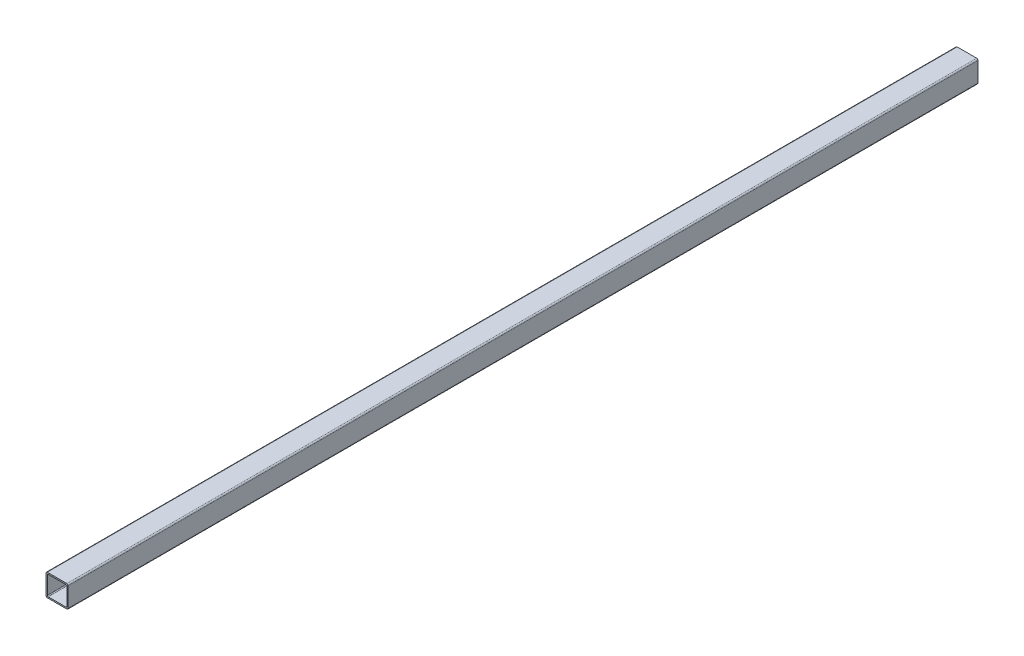
ISO-10303-21;
HEADER;
FILE_DESCRIPTION(('STEP AP214'),'2;1');
FILE_NAME('part.step','',(''),(''),'','','');
FILE_SCHEMA(('AUTOMOTIVE_DESIGN { 1 0 10303 214 1 1 1 1 }'));
ENDSEC;
DATA;
#1=APPLICATION_CONTEXT('core data for automotive mechanical design processes');
#2=APPLICATION_PROTOCOL_DEFINITION('international standard','automotive_design',2000,#1);
#3=PRODUCT_CONTEXT('',#1,'mechanical');
#4=PRODUCT('Part','Part','',(#3));
#5=PRODUCT_RELATED_PRODUCT_CATEGORY('part','',(#4));
#6=PRODUCT_DEFINITION_FORMATION('','',#4);
#7=PRODUCT_DEFINITION_CONTEXT('part definition',#1,'design');
#8=PRODUCT_DEFINITION('design','',#6,#7);
#9=PRODUCT_DEFINITION_SHAPE('','',#8);
#10=(LENGTH_UNIT() NAMED_UNIT(*) SI_UNIT(.MILLI.,.METRE.));
#11=(NAMED_UNIT(*) PLANE_ANGLE_UNIT() SI_UNIT($,.RADIAN.));
#12=(NAMED_UNIT(*) SI_UNIT($,.STERADIAN.) SOLID_ANGLE_UNIT());
#13=UNCERTAINTY_MEASURE_WITH_UNIT(LENGTH_MEASURE(1.E-05),#10,'distance_accuracy_value','');
#14=(GEOMETRIC_REPRESENTATION_CONTEXT(3) GLOBAL_UNCERTAINTY_ASSIGNED_CONTEXT((#13)) GLOBAL_UNIT_ASSIGNED_CONTEXT((#10,
#11,#12)) REPRESENTATION_CONTEXT('',''));
#15=CARTESIAN_POINT('',(0.,0.,0.));
#16=DIRECTION('',(0.,0.,1.));
#17=DIRECTION('',(1.,0.,0.));
#18=AXIS2_PLACEMENT_3D('',#15,#16,#17);
#19=CARTESIAN_POINT('',(-22.,-22.,-2054.3306612069));
#20=DIRECTION('',(0.,0.,1.));
#21=DIRECTION('',(1.,0.,0.));
#22=AXIS2_PLACEMENT_3D('',#19,#20,#21);
#23=CYLINDRICAL_SURFACE('',#22,3.);
#24=CARTESIAN_POINT('',(-22.,-22.,0.));
#25=DIRECTION('',(0.,0.,1.));
#26=DIRECTION('',(1.,0.,0.));
#27=AXIS2_PLACEMENT_3D('',#24,#25,#26);
#28=CIRCLE('',#27,3.);
#29=CARTESIAN_POINT('',(-25.,-22.,0.));
#30=VERTEX_POINT('',#29);
#31=CARTESIAN_POINT('',(-22.,-25.,0.));
#32=VERTEX_POINT('',#31);
#33=EDGE_CURVE('E204',#30,#32,#28,.T.);
#34=ORIENTED_EDGE('',*,*,#33,.F.);
#35=DIRECTION('',(0.,0.,1.));
#36=VECTOR('',#35,1.);
#37=CARTESIAN_POINT('',(-25.,-22.,-2054.3306612069));
#38=LINE('',#37,#36);
#39=CARTESIAN_POINT('',(-25.,-22.,-2054.3306612069));
#40=VERTEX_POINT('',#39);
#41=EDGE_CURVE('E11',#40,#30,#38,.T.);
#42=ORIENTED_EDGE('',*,*,#41,.F.);
#43=CARTESIAN_POINT('',(-22.,-22.,-2054.3306612069));
#44=DIRECTION('',(0.,0.,1.));
#45=DIRECTION('',(1.,0.,0.));
#46=AXIS2_PLACEMENT_3D('',#43,#44,#45);
#47=CIRCLE('',#46,3.);
#48=CARTESIAN_POINT('',(-22.,-25.,-2054.3306612069));
#49=VERTEX_POINT('',#48);
#50=EDGE_CURVE('E216',#40,#49,#47,.T.);
#51=ORIENTED_EDGE('',*,*,#50,.T.);
#52=DIRECTION('',(0.,0.,1.));
#53=VECTOR('',#52,1.);
#54=CARTESIAN_POINT('',(-22.,-25.,-2054.3306612069));
#55=LINE('',#54,#53);
#56=EDGE_CURVE('E37',#49,#32,#55,.T.);
#57=ORIENTED_EDGE('',*,*,#56,.T.);
#58=EDGE_LOOP('',(#34,#42,#51,#57));
#59=FACE_BOUND('',#58,.T.);
#60=ADVANCED_FACE('F34',(#59),#23,.T.);
#61=CARTESIAN_POINT('',(-25.,22.,-2054.3306612069));
#62=DIRECTION('',(-1.,0.,0.));
#63=DIRECTION('',(0.,0.,1.));
#64=AXIS2_PLACEMENT_3D('',#61,#62,#63);
#65=PLANE('',#64);
#66=DIRECTION('',(0.,-1.,0.));
#67=VECTOR('',#66,1.);
#68=CARTESIAN_POINT('',(-25.,22.,0.));
#69=LINE('',#68,#67);
#70=CARTESIAN_POINT('',(-25.,22.,0.));
#71=VERTEX_POINT('',#70);
#72=EDGE_CURVE('E220',#71,#30,#69,.T.);
#73=ORIENTED_EDGE('',*,*,#72,.F.);
#74=DIRECTION('',(0.,0.,1.));
#75=VECTOR('',#74,1.);
#76=CARTESIAN_POINT('',(-25.,22.,-2054.3306612069));
#77=LINE('',#76,#75);
#78=CARTESIAN_POINT('',(-25.,22.,-2054.3306612069));
#79=VERTEX_POINT('',#78);
#80=EDGE_CURVE('E42',#79,#71,#77,.T.);
#81=ORIENTED_EDGE('',*,*,#80,.F.);
#82=DIRECTION('',(0.,-1.,0.));
#83=VECTOR('',#82,1.);
#84=CARTESIAN_POINT('',(-25.,22.,-2054.3306612069));
#85=LINE('',#84,#83);
#86=EDGE_CURVE('E238',#79,#40,#85,.T.);
#87=ORIENTED_EDGE('',*,*,#86,.T.);
#88=ORIENTED_EDGE('',*,*,#41,.T.);
#89=EDGE_LOOP('',(#73,#81,#87,#88));
#90=FACE_BOUND('',#89,.T.);
#91=ADVANCED_FACE('F285',(#90),#65,.T.);
#92=CARTESIAN_POINT('',(-22.,22.,-2054.3306612069));
#93=DIRECTION('',(0.,0.,1.));
#94=DIRECTION('',(1.,0.,0.));
#95=AXIS2_PLACEMENT_3D('',#92,#93,#94);
#96=CYLINDRICAL_SURFACE('',#95,3.);
#97=CARTESIAN_POINT('',(-22.,22.,0.));
#98=DIRECTION('',(0.,0.,1.));
#99=DIRECTION('',(1.,0.,0.));
#100=AXIS2_PLACEMENT_3D('',#97,#98,#99);
#101=CIRCLE('',#100,3.);
#102=CARTESIAN_POINT('',(-22.,25.,0.));
#103=VERTEX_POINT('',#102);
#104=EDGE_CURVE('E258',#103,#71,#101,.T.);
#105=ORIENTED_EDGE('',*,*,#104,.F.);
#106=DIRECTION('',(0.,0.,1.));
#107=VECTOR('',#106,1.);
#108=CARTESIAN_POINT('',(-22.,25.,-2054.3306612069));
#109=LINE('',#108,#107);
#110=CARTESIAN_POINT('',(-22.,25.,-2054.3306612069));
#111=VERTEX_POINT('',#110);
#112=EDGE_CURVE('E264',#111,#103,#109,.T.);
#113=ORIENTED_EDGE('',*,*,#112,.F.);
#114=CARTESIAN_POINT('',(-22.,22.,-2054.3306612069));
#115=DIRECTION('',(0.,0.,1.));
#116=DIRECTION('',(1.,0.,0.));
#117=AXIS2_PLACEMENT_3D('',#114,#115,#116);
#118=CIRCLE('',#117,3.);
#119=EDGE_CURVE('E235',#111,#79,#118,.T.);
#120=ORIENTED_EDGE('',*,*,#119,.T.);
#121=ORIENTED_EDGE('',*,*,#80,.T.);
#122=EDGE_LOOP('',(#105,#113,#120,#121));
#123=FACE_BOUND('',#122,.T.);
#124=ADVANCED_FACE('F304',(#123),#96,.T.);
#125=CARTESIAN_POINT('',(-22.,25.,-2054.3306612069));
#126=DIRECTION('',(0.,1.,0.));
#127=DIRECTION('',(-1.,0.,0.));
#128=AXIS2_PLACEMENT_3D('',#125,#126,#127);
#129=PLANE('',#128);
#130=DIRECTION('',(-1.,0.,0.));
#131=VECTOR('',#130,1.);
#132=CARTESIAN_POINT('',(-22.,25.,0.));
#133=LINE('',#132,#131);
#134=CARTESIAN_POINT('',(22.,25.,0.));
#135=VERTEX_POINT('',#134);
#136=EDGE_CURVE('E255',#135,#103,#133,.T.);
#137=ORIENTED_EDGE('',*,*,#136,.F.);
#138=DIRECTION('',(0.,0.,1.));
#139=VECTOR('',#138,1.);
#140=CARTESIAN_POINT('',(22.,25.,-2054.3306612069));
#141=LINE('',#140,#139);
#142=CARTESIAN_POINT('',(22.,25.,-2054.3306612069));
#143=VERTEX_POINT('',#142);
#144=EDGE_CURVE('E266',#143,#135,#141,.T.);
#145=ORIENTED_EDGE('',*,*,#144,.F.);
#146=DIRECTION('',(-1.,0.,0.));
#147=VECTOR('',#146,1.);
#148=CARTESIAN_POINT('',(-22.,25.,-2054.3306612069));
#149=LINE('',#148,#147);
#150=EDGE_CURVE('E232',#143,#111,#149,.T.);
#151=ORIENTED_EDGE('',*,*,#150,.T.);
#152=ORIENTED_EDGE('',*,*,#112,.T.);
#153=EDGE_LOOP('',(#137,#145,#151,#152));
#154=FACE_BOUND('',#153,.T.);
#155=ADVANCED_FACE('F302',(#154),#129,.T.);
#156=CARTESIAN_POINT('',(22.,22.,-2054.3306612069));
#157=DIRECTION('',(0.,0.,1.));
#158=DIRECTION('',(1.,0.,0.));
#159=AXIS2_PLACEMENT_3D('',#156,#157,#158);
#160=CYLINDRICAL_SURFACE('',#159,3.00000000000001);
#161=CARTESIAN_POINT('',(22.,22.,0.));
#162=DIRECTION('',(0.,0.,1.));
#163=DIRECTION('',(-1.,0.,0.));
#164=AXIS2_PLACEMENT_3D('',#161,#162,#163);
#165=CIRCLE('',#164,3.00000000000001);
#166=CARTESIAN_POINT('',(25.,22.,0.));
#167=VERTEX_POINT('',#166);
#168=EDGE_CURVE('E252',#167,#135,#165,.T.);
#169=ORIENTED_EDGE('',*,*,#168,.F.);
#170=DIRECTION('',(0.,0.,1.));
#171=VECTOR('',#170,1.);
#172=CARTESIAN_POINT('',(25.,22.,-2054.3306612069));
#173=LINE('',#172,#171);
#174=CARTESIAN_POINT('',(25.,22.,-2054.3306612069));
#175=VERTEX_POINT('',#174);
#176=EDGE_CURVE('E268',#175,#167,#173,.T.);
#177=ORIENTED_EDGE('',*,*,#176,.F.);
#178=CARTESIAN_POINT('',(22.,22.,-2054.3306612069));
#179=DIRECTION('',(0.,0.,1.));
#180=DIRECTION('',(-1.,0.,0.));
#181=AXIS2_PLACEMENT_3D('',#178,#179,#180);
#182=CIRCLE('',#181,3.00000000000001);
#183=EDGE_CURVE('E229',#175,#143,#182,.T.);
#184=ORIENTED_EDGE('',*,*,#183,.T.);
#185=ORIENTED_EDGE('',*,*,#144,.T.);
#186=EDGE_LOOP('',(#169,#177,#184,#185));
#187=FACE_BOUND('',#186,.T.);
#188=ADVANCED_FACE('F298',(#187),#160,.T.);
#189=CARTESIAN_POINT('',(25.,22.,-2054.3306612069));
#190=DIRECTION('',(1.,0.,0.));
#191=DIRECTION('',(0.,0.,-1.));
#192=AXIS2_PLACEMENT_3D('',#189,#190,#191);
#193=PLANE('',#192);
#194=DIRECTION('',(0.,1.,0.));
#195=VECTOR('',#194,1.);
#196=CARTESIAN_POINT('',(25.,22.,0.));
#197=LINE('',#196,#195);
#198=CARTESIAN_POINT('',(25.,-22.,0.));
#199=VERTEX_POINT('',#198);
#200=EDGE_CURVE('E249',#199,#167,#197,.T.);
#201=ORIENTED_EDGE('',*,*,#200,.F.);
#202=DIRECTION('',(0.,0.,1.));
#203=VECTOR('',#202,1.);
#204=CARTESIAN_POINT('',(25.,-22.,-2054.3306612069));
#205=LINE('',#204,#203);
#206=CARTESIAN_POINT('',(25.,-22.,-2054.3306612069));
#207=VERTEX_POINT('',#206);
#208=EDGE_CURVE('E270',#207,#199,#205,.T.);
#209=ORIENTED_EDGE('',*,*,#208,.F.);
#210=DIRECTION('',(0.,1.,0.));
#211=VECTOR('',#210,1.);
#212=CARTESIAN_POINT('',(25.,22.,-2054.3306612069));
#213=LINE('',#212,#211);
#214=EDGE_CURVE('E226',#207,#175,#213,.T.);
#215=ORIENTED_EDGE('',*,*,#214,.T.);
#216=ORIENTED_EDGE('',*,*,#176,.T.);
#217=EDGE_LOOP('',(#201,#209,#215,#216));
#218=FACE_BOUND('',#217,.T.);
#219=ADVANCED_FACE('F296',(#218),#193,.T.);
#220=CARTESIAN_POINT('',(22.,-22.,-2054.3306612069));
#221=DIRECTION('',(0.,0.,1.));
#222=DIRECTION('',(1.,0.,0.));
#223=AXIS2_PLACEMENT_3D('',#220,#221,#222);
#224=CYLINDRICAL_SURFACE('',#223,3.);
#225=CARTESIAN_POINT('',(22.,-22.,0.));
#226=DIRECTION('',(0.,0.,1.));
#227=DIRECTION('',(1.,0.,0.));
#228=AXIS2_PLACEMENT_3D('',#225,#226,#227);
#229=CIRCLE('',#228,3.);
#230=CARTESIAN_POINT('',(22.,-25.,0.));
#231=VERTEX_POINT('',#230);
#232=EDGE_CURVE('E246',#231,#199,#229,.T.);
#233=ORIENTED_EDGE('',*,*,#232,.F.);
#234=DIRECTION('',(0.,0.,1.));
#235=VECTOR('',#234,1.);
#236=CARTESIAN_POINT('',(22.,-25.,-2054.3306612069));
#237=LINE('',#236,#235);
#238=CARTESIAN_POINT('',(22.,-25.,-2054.3306612069));
#239=VERTEX_POINT('',#238);
#240=EDGE_CURVE('E271',#239,#231,#237,.T.);
#241=ORIENTED_EDGE('',*,*,#240,.F.);
#242=CARTESIAN_POINT('',(22.,-22.,-2054.3306612069));
#243=DIRECTION('',(0.,0.,1.));
#244=DIRECTION('',(1.,0.,0.));
#245=AXIS2_PLACEMENT_3D('',#242,#243,#244);
#246=CIRCLE('',#245,3.);
#247=EDGE_CURVE('E223',#239,#207,#246,.T.);
#248=ORIENTED_EDGE('',*,*,#247,.T.);
#249=ORIENTED_EDGE('',*,*,#208,.T.);
#250=EDGE_LOOP('',(#233,#241,#248,#249));
#251=FACE_BOUND('',#250,.T.);
#252=ADVANCED_FACE('F292',(#251),#224,.T.);
#253=CARTESIAN_POINT('',(-22.,-25.,-2054.3306612069));
#254=DIRECTION('',(0.,-1.,0.));
#255=DIRECTION('',(0.,0.,-1.));
#256=AXIS2_PLACEMENT_3D('',#253,#254,#255);
#257=PLANE('',#256);
#258=DIRECTION('',(1.,0.,0.));
#259=VECTOR('',#258,1.);
#260=CARTESIAN_POINT('',(-22.,-25.,0.));
#261=LINE('',#260,#259);
#262=EDGE_CURVE('E243',#32,#231,#261,.T.);
#263=ORIENTED_EDGE('',*,*,#262,.F.);
#264=ORIENTED_EDGE('',*,*,#56,.F.);
#265=DIRECTION('',(1.,0.,0.));
#266=VECTOR('',#265,1.);
#267=CARTESIAN_POINT('',(-22.,-25.,-2054.3306612069));
#268=LINE('',#267,#266);
#269=EDGE_CURVE('E219',#49,#239,#268,.T.);
#270=ORIENTED_EDGE('',*,*,#269,.T.);
#271=ORIENTED_EDGE('',*,*,#240,.T.);
#272=EDGE_LOOP('',(#263,#264,#270,#271));
#273=FACE_BOUND('',#272,.T.);
#274=ADVANCED_FACE('F279',(#273),#257,.T.);
#275=CARTESIAN_POINT('',(-22.,-22.,-2054.3306612069));
#276=DIRECTION('',(0.,0.,1.));
#277=DIRECTION('',(1.,0.,0.));
#278=AXIS2_PLACEMENT_3D('',#275,#276,#277);
#279=PLANE('',#278);
#280=DIRECTION('',(0.,-1.,0.));
#281=VECTOR('',#280,1.);
#282=CARTESIAN_POINT('',(-22.,20.,-2054.3306612069));
#283=LINE('',#282,#281);
#284=CARTESIAN_POINT('',(-22.,20.,-2054.3306612069));
#285=VERTEX_POINT('',#284);
#286=CARTESIAN_POINT('',(-22.,-20.,-2054.3306612069));
#287=VERTEX_POINT('',#286);
#288=EDGE_CURVE('E155',#285,#287,#283,.T.);
#289=ORIENTED_EDGE('',*,*,#288,.T.);
#290=CARTESIAN_POINT('',(-20.,-20.,-2054.3306612069));
#291=DIRECTION('',(0.,0.,1.));
#292=DIRECTION('',(1.,0.,0.));
#293=AXIS2_PLACEMENT_3D('',#290,#291,#292);
#294=CIRCLE('',#293,2.);
#295=CARTESIAN_POINT('',(-20.,-22.,-2054.3306612069));
#296=VERTEX_POINT('',#295);
#297=EDGE_CURVE('E149',#287,#296,#294,.T.);
#298=ORIENTED_EDGE('',*,*,#297,.T.);
#299=DIRECTION('',(1.,0.,0.));
#300=VECTOR('',#299,1.);
#301=CARTESIAN_POINT('',(-20.,-22.,-2054.3306612069));
#302=LINE('',#301,#300);
#303=CARTESIAN_POINT('',(20.,-22.,-2054.3306612069));
#304=VERTEX_POINT('',#303);
#305=EDGE_CURVE('E158',#296,#304,#302,.T.);
#306=ORIENTED_EDGE('',*,*,#305,.T.);
#307=CARTESIAN_POINT('',(20.,-20.,-2054.3306612069));
#308=DIRECTION('',(0.,0.,1.));
#309=DIRECTION('',(1.,0.,0.));
#310=AXIS2_PLACEMENT_3D('',#307,#308,#309);
#311=CIRCLE('',#310,2.);
#312=CARTESIAN_POINT('',(22.,-20.,-2054.3306612069));
#313=VERTEX_POINT('',#312);
#314=EDGE_CURVE('E50',#304,#313,#311,.T.);
#315=ORIENTED_EDGE('',*,*,#314,.T.);
#316=DIRECTION('',(0.,1.,0.));
#317=VECTOR('',#316,1.);
#318=CARTESIAN_POINT('',(22.,20.,-2054.3306612069));
#319=LINE('',#318,#317);
#320=CARTESIAN_POINT('',(22.,20.,-2054.3306612069));
#321=VERTEX_POINT('',#320);
#322=EDGE_CURVE('E173',#313,#321,#319,.T.);
#323=ORIENTED_EDGE('',*,*,#322,.T.);
#324=CARTESIAN_POINT('',(20.,20.,-2054.3306612069));
#325=DIRECTION('',(0.,0.,1.));
#326=DIRECTION('',(-1.,0.,0.));
#327=AXIS2_PLACEMENT_3D('',#324,#325,#326);
#328=CIRCLE('',#327,2.);
#329=CARTESIAN_POINT('',(20.,22.,-2054.3306612069));
#330=VERTEX_POINT('',#329);
#331=EDGE_CURVE('E176',#321,#330,#328,.T.);
#332=ORIENTED_EDGE('',*,*,#331,.T.);
#333=DIRECTION('',(-1.,0.,0.));
#334=VECTOR('',#333,1.);
#335=CARTESIAN_POINT('',(-20.,22.,-2054.3306612069));
#336=LINE('',#335,#334);
#337=CARTESIAN_POINT('',(-20.,22.,-2054.3306612069));
#338=VERTEX_POINT('',#337);
#339=EDGE_CURVE('E179',#330,#338,#336,.T.);
#340=ORIENTED_EDGE('',*,*,#339,.T.);
#341=CARTESIAN_POINT('',(-20.,20.,-2054.3306612069));
#342=DIRECTION('',(0.,0.,1.));
#343=DIRECTION('',(1.,0.,0.));
#344=AXIS2_PLACEMENT_3D('',#341,#342,#343);
#345=CIRCLE('',#344,2.);
#346=EDGE_CURVE('E182',#338,#285,#345,.T.);
#347=ORIENTED_EDGE('',*,*,#346,.T.);
#348=EDGE_LOOP('',(#289,#298,#306,#315,#323,#332,#340,#347));
#349=FACE_BOUND('',#348,.T.);
#350=ORIENTED_EDGE('',*,*,#50,.F.);
#351=ORIENTED_EDGE('',*,*,#86,.F.);
#352=ORIENTED_EDGE('',*,*,#119,.F.);
#353=ORIENTED_EDGE('',*,*,#150,.F.);
#354=ORIENTED_EDGE('',*,*,#183,.F.);
#355=ORIENTED_EDGE('',*,*,#214,.F.);
#356=ORIENTED_EDGE('',*,*,#247,.F.);
#357=ORIENTED_EDGE('',*,*,#269,.F.);
#358=EDGE_LOOP('',(#350,#351,#352,#353,#354,#355,#356,#357));
#359=FACE_BOUND('',#358,.T.);
#360=ADVANCED_FACE('F162',(#349,#359),#279,.F.);
#361=CARTESIAN_POINT('',(-22.,-22.,0.));
#362=DIRECTION('',(0.,0.,1.));
#363=DIRECTION('',(1.,0.,0.));
#364=AXIS2_PLACEMENT_3D('',#361,#362,#363);
#365=PLANE('',#364);
#366=CARTESIAN_POINT('',(-20.,-20.,0.));
#367=DIRECTION('',(0.,0.,1.));
#368=DIRECTION('',(1.,0.,0.));
#369=AXIS2_PLACEMENT_3D('',#366,#367,#368);
#370=CIRCLE('',#369,2.);
#371=CARTESIAN_POINT('',(-22.,-20.,0.));
#372=VERTEX_POINT('',#371);
#373=CARTESIAN_POINT('',(-20.,-22.,0.));
#374=VERTEX_POINT('',#373);
#375=EDGE_CURVE('E58',#372,#374,#370,.T.);
#376=ORIENTED_EDGE('',*,*,#375,.F.);
#377=DIRECTION('',(0.,-1.,0.));
#378=VECTOR('',#377,1.);
#379=CARTESIAN_POINT('',(-22.,20.,0.));
#380=LINE('',#379,#378);
#381=CARTESIAN_POINT('',(-22.,20.,0.));
#382=VERTEX_POINT('',#381);
#383=EDGE_CURVE('E166',#382,#372,#380,.T.);
#384=ORIENTED_EDGE('',*,*,#383,.F.);
#385=CARTESIAN_POINT('',(-20.,20.,0.));
#386=DIRECTION('',(0.,0.,1.));
#387=DIRECTION('',(1.,0.,0.));
#388=AXIS2_PLACEMENT_3D('',#385,#386,#387);
#389=CIRCLE('',#388,2.);
#390=CARTESIAN_POINT('',(-20.,22.,0.));
#391=VERTEX_POINT('',#390);
#392=EDGE_CURVE('E169',#391,#382,#389,.T.);
#393=ORIENTED_EDGE('',*,*,#392,.F.);
#394=DIRECTION('',(-1.,0.,0.));
#395=VECTOR('',#394,1.);
#396=CARTESIAN_POINT('',(-20.,22.,0.));
#397=LINE('',#396,#395);
#398=CARTESIAN_POINT('',(20.,22.,0.));
#399=VERTEX_POINT('',#398);
#400=EDGE_CURVE('E197',#399,#391,#397,.T.);
#401=ORIENTED_EDGE('',*,*,#400,.F.);
#402=CARTESIAN_POINT('',(20.,20.,0.));
#403=DIRECTION('',(0.,0.,1.));
#404=DIRECTION('',(-1.,0.,0.));
#405=AXIS2_PLACEMENT_3D('',#402,#403,#404);
#406=CIRCLE('',#405,2.);
#407=CARTESIAN_POINT('',(22.,20.,0.));
#408=VERTEX_POINT('',#407);
#409=EDGE_CURVE('E194',#408,#399,#406,.T.);
#410=ORIENTED_EDGE('',*,*,#409,.F.);
#411=DIRECTION('',(0.,1.,0.));
#412=VECTOR('',#411,1.);
#413=CARTESIAN_POINT('',(22.,20.,0.));
#414=LINE('',#413,#412);
#415=CARTESIAN_POINT('',(22.,-20.,0.));
#416=VERTEX_POINT('',#415);
#417=EDGE_CURVE('E191',#416,#408,#414,.T.);
#418=ORIENTED_EDGE('',*,*,#417,.F.);
#419=CARTESIAN_POINT('',(20.,-20.,0.));
#420=DIRECTION('',(0.,0.,1.));
#421=DIRECTION('',(1.,0.,0.));
#422=AXIS2_PLACEMENT_3D('',#419,#420,#421);
#423=CIRCLE('',#422,2.);
#424=CARTESIAN_POINT('',(20.,-22.,0.));
#425=VERTEX_POINT('',#424);
#426=EDGE_CURVE('E188',#425,#416,#423,.T.);
#427=ORIENTED_EDGE('',*,*,#426,.F.);
#428=DIRECTION('',(1.,0.,0.));
#429=VECTOR('',#428,1.);
#430=CARTESIAN_POINT('',(-20.,-22.,0.));
#431=LINE('',#430,#429);
#432=EDGE_CURVE('E186',#374,#425,#431,.T.);
#433=ORIENTED_EDGE('',*,*,#432,.F.);
#434=EDGE_LOOP('',(#376,#384,#393,#401,#410,#418,#427,#433));
#435=FACE_BOUND('',#434,.T.);
#436=ORIENTED_EDGE('',*,*,#33,.T.);
#437=ORIENTED_EDGE('',*,*,#262,.T.);
#438=ORIENTED_EDGE('',*,*,#232,.T.);
#439=ORIENTED_EDGE('',*,*,#200,.T.);
#440=ORIENTED_EDGE('',*,*,#168,.T.);
#441=ORIENTED_EDGE('',*,*,#136,.T.);
#442=ORIENTED_EDGE('',*,*,#104,.T.);
#443=ORIENTED_EDGE('',*,*,#72,.T.);
#444=EDGE_LOOP('',(#436,#437,#438,#439,#440,#441,#442,#443));
#445=FACE_BOUND('',#444,.T.);
#446=ADVANCED_FACE('F281',(#435,#445),#365,.T.);
#447=CARTESIAN_POINT('',(-20.,-20.,-2054.3306612069));
#448=DIRECTION('',(0.,0.,1.));
#449=DIRECTION('',(1.,0.,0.));
#450=AXIS2_PLACEMENT_3D('',#447,#448,#449);
#451=CYLINDRICAL_SURFACE('',#450,2.);
#452=ORIENTED_EDGE('',*,*,#375,.T.);
#453=DIRECTION('',(0.,0.,1.));
#454=VECTOR('',#453,1.);
#455=CARTESIAN_POINT('',(-20.,-22.,-2054.3306612069));
#456=LINE('',#455,#454);
#457=EDGE_CURVE('E145',#296,#374,#456,.T.);
#458=ORIENTED_EDGE('',*,*,#457,.F.);
#459=ORIENTED_EDGE('',*,*,#297,.F.);
#460=DIRECTION('',(0.,0.,1.));
#461=VECTOR('',#460,1.);
#462=CARTESIAN_POINT('',(-22.,-20.,-2054.3306612069));
#463=LINE('',#462,#461);
#464=EDGE_CURVE('E202',#287,#372,#463,.T.);
#465=ORIENTED_EDGE('',*,*,#464,.T.);
#466=EDGE_LOOP('',(#452,#458,#459,#465));
#467=FACE_BOUND('',#466,.T.);
#468=ADVANCED_FACE('F147',(#467),#451,.F.);
#469=CARTESIAN_POINT('',(-22.,20.,-2054.3306612069));
#470=DIRECTION('',(-1.,0.,0.));
#471=DIRECTION('',(0.,0.,1.));
#472=AXIS2_PLACEMENT_3D('',#469,#470,#471);
#473=PLANE('',#472);
#474=ORIENTED_EDGE('',*,*,#383,.T.);
#475=ORIENTED_EDGE('',*,*,#464,.F.);
#476=ORIENTED_EDGE('',*,*,#288,.F.);
#477=DIRECTION('',(0.,0.,1.));
#478=VECTOR('',#477,1.);
#479=CARTESIAN_POINT('',(-22.,20.,-2054.3306612069));
#480=LINE('',#479,#478);
#481=EDGE_CURVE('E205',#285,#382,#480,.T.);
#482=ORIENTED_EDGE('',*,*,#481,.T.);
#483=EDGE_LOOP('',(#474,#475,#476,#482));
#484=FACE_BOUND('',#483,.T.);
#485=ADVANCED_FACE('F387',(#484),#473,.F.);
#486=CARTESIAN_POINT('',(-20.,20.,-2054.3306612069));
#487=DIRECTION('',(0.,0.,1.));
#488=DIRECTION('',(1.,0.,0.));
#489=AXIS2_PLACEMENT_3D('',#486,#487,#488);
#490=CYLINDRICAL_SURFACE('',#489,2.);
#491=ORIENTED_EDGE('',*,*,#392,.T.);
#492=ORIENTED_EDGE('',*,*,#481,.F.);
#493=ORIENTED_EDGE('',*,*,#346,.F.);
#494=DIRECTION('',(0.,0.,1.));
#495=VECTOR('',#494,1.);
#496=CARTESIAN_POINT('',(-20.,22.,-2054.3306612069));
#497=LINE('',#496,#495);
#498=EDGE_CURVE('E207',#338,#391,#497,.T.);
#499=ORIENTED_EDGE('',*,*,#498,.T.);
#500=EDGE_LOOP('',(#491,#492,#493,#499));
#501=FACE_BOUND('',#500,.T.);
#502=ADVANCED_FACE('F396',(#501),#490,.F.);
#503=CARTESIAN_POINT('',(-20.,22.,-2054.3306612069));
#504=DIRECTION('',(0.,1.,0.));
#505=DIRECTION('',(0.,0.,1.));
#506=AXIS2_PLACEMENT_3D('',#503,#504,#505);
#507=PLANE('',#506);
#508=ORIENTED_EDGE('',*,*,#400,.T.);
#509=ORIENTED_EDGE('',*,*,#498,.F.);
#510=ORIENTED_EDGE('',*,*,#339,.F.);
#511=DIRECTION('',(0.,0.,1.));
#512=VECTOR('',#511,1.);
#513=CARTESIAN_POINT('',(20.,22.,-2054.3306612069));
#514=LINE('',#513,#512);
#515=EDGE_CURVE('E209',#330,#399,#514,.T.);
#516=ORIENTED_EDGE('',*,*,#515,.T.);
#517=EDGE_LOOP('',(#508,#509,#510,#516));
#518=FACE_BOUND('',#517,.T.);
#519=ADVANCED_FACE('F406',(#518),#507,.F.);
#520=CARTESIAN_POINT('',(20.,20.,-2054.3306612069));
#521=DIRECTION('',(0.,0.,1.));
#522=DIRECTION('',(1.,0.,0.));
#523=AXIS2_PLACEMENT_3D('',#520,#521,#522);
#524=CYLINDRICAL_SURFACE('',#523,2.);
#525=ORIENTED_EDGE('',*,*,#409,.T.);
#526=ORIENTED_EDGE('',*,*,#515,.F.);
#527=ORIENTED_EDGE('',*,*,#331,.F.);
#528=DIRECTION('',(0.,0.,1.));
#529=VECTOR('',#528,1.);
#530=CARTESIAN_POINT('',(22.,20.,-2054.3306612069));
#531=LINE('',#530,#529);
#532=EDGE_CURVE('E211',#321,#408,#531,.T.);
#533=ORIENTED_EDGE('',*,*,#532,.T.);
#534=EDGE_LOOP('',(#525,#526,#527,#533));
#535=FACE_BOUND('',#534,.T.);
#536=ADVANCED_FACE('F416',(#535),#524,.F.);
#537=CARTESIAN_POINT('',(22.,20.,-2054.3306612069));
#538=DIRECTION('',(1.,0.,0.));
#539=DIRECTION('',(0.,0.,-1.));
#540=AXIS2_PLACEMENT_3D('',#537,#538,#539);
#541=PLANE('',#540);
#542=ORIENTED_EDGE('',*,*,#417,.T.);
#543=ORIENTED_EDGE('',*,*,#532,.F.);
#544=ORIENTED_EDGE('',*,*,#322,.F.);
#545=DIRECTION('',(0.,0.,1.));
#546=VECTOR('',#545,1.);
#547=CARTESIAN_POINT('',(22.,-20.,-2054.3306612069));
#548=LINE('',#547,#546);
#549=EDGE_CURVE('E213',#313,#416,#548,.T.);
#550=ORIENTED_EDGE('',*,*,#549,.T.);
#551=EDGE_LOOP('',(#542,#543,#544,#550));
#552=FACE_BOUND('',#551,.T.);
#553=ADVANCED_FACE('F426',(#552),#541,.F.);
#554=CARTESIAN_POINT('',(20.,-20.,-2054.3306612069));
#555=DIRECTION('',(0.,0.,1.));
#556=DIRECTION('',(1.,0.,0.));
#557=AXIS2_PLACEMENT_3D('',#554,#555,#556);
#558=CYLINDRICAL_SURFACE('',#557,2.);
#559=ORIENTED_EDGE('',*,*,#426,.T.);
#560=ORIENTED_EDGE('',*,*,#549,.F.);
#561=ORIENTED_EDGE('',*,*,#314,.F.);
#562=DIRECTION('',(0.,0.,1.));
#563=VECTOR('',#562,1.);
#564=CARTESIAN_POINT('',(20.,-22.,-2054.3306612069));
#565=LINE('',#564,#563);
#566=EDGE_CURVE('E154',#304,#425,#565,.T.);
#567=ORIENTED_EDGE('',*,*,#566,.T.);
#568=EDGE_LOOP('',(#559,#560,#561,#567));
#569=FACE_BOUND('',#568,.T.);
#570=ADVANCED_FACE('F436',(#569),#558,.F.);
#571=CARTESIAN_POINT('',(-20.,-22.,-2054.3306612069));
#572=DIRECTION('',(0.,-1.,0.));
#573=DIRECTION('',(0.,0.,-1.));
#574=AXIS2_PLACEMENT_3D('',#571,#572,#573);
#575=PLANE('',#574);
#576=ORIENTED_EDGE('',*,*,#432,.T.);
#577=ORIENTED_EDGE('',*,*,#566,.F.);
#578=ORIENTED_EDGE('',*,*,#305,.F.);
#579=ORIENTED_EDGE('',*,*,#457,.T.);
#580=EDGE_LOOP('',(#576,#577,#578,#579));
#581=FACE_BOUND('',#580,.T.);
#582=ADVANCED_FACE('F159',(#581),#575,.F.);
#583=CLOSED_SHELL('',(#60,#91,#124,#155,#188,#219,#252,#274,#360,#446,#468,#485,#502,#519,#536,
#553,#570,#582));
#584=MANIFOLD_SOLID_BREP('B2',#583);
#585=ADVANCED_BREP_SHAPE_REPRESENTATION('',(#18,#584),#14);
#586=SHAPE_DEFINITION_REPRESENTATION(#9,#585);
ENDSEC;
END-ISO-10303-21;
